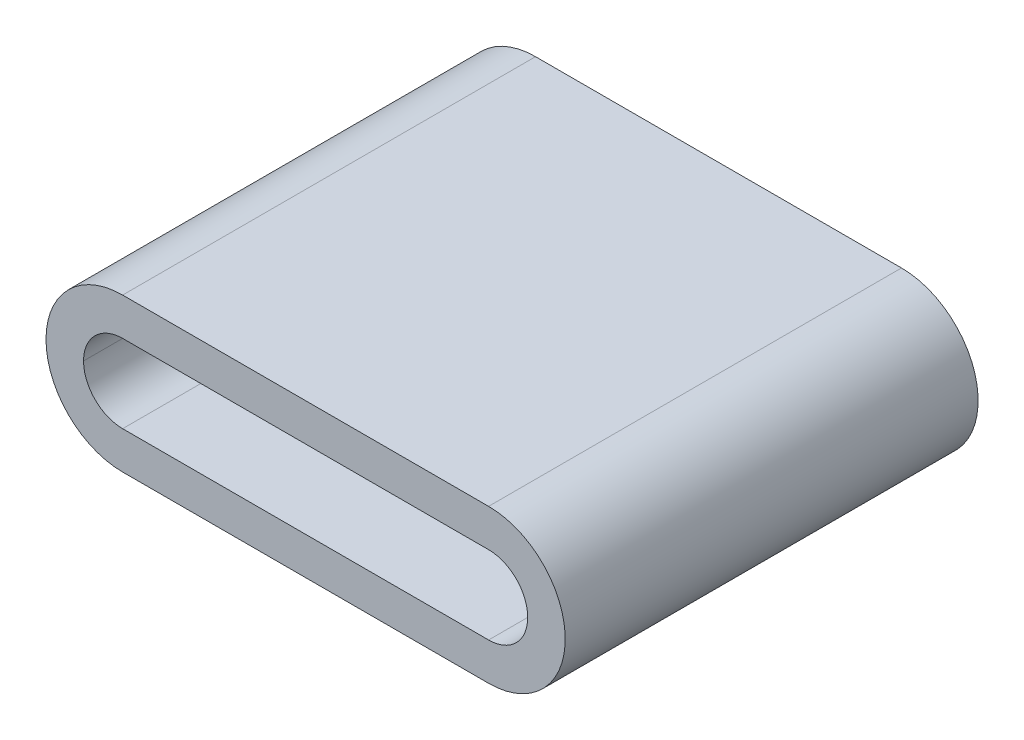
ISO-10303-21;
HEADER;
FILE_DESCRIPTION(('STEP AP214'),'2;1');
FILE_NAME('part.step','',(''),(''),'','','');
FILE_SCHEMA(('AUTOMOTIVE_DESIGN { 1 0 10303 214 1 1 1 1 }'));
ENDSEC;
DATA;
#1=APPLICATION_CONTEXT('core data for automotive mechanical design processes');
#2=APPLICATION_PROTOCOL_DEFINITION('international standard','automotive_design',2000,#1);
#3=PRODUCT_CONTEXT('',#1,'mechanical');
#4=PRODUCT('Part','Part','',(#3));
#5=PRODUCT_RELATED_PRODUCT_CATEGORY('part','',(#4));
#6=PRODUCT_DEFINITION_FORMATION('','',#4);
#7=PRODUCT_DEFINITION_CONTEXT('part definition',#1,'design');
#8=PRODUCT_DEFINITION('design','',#6,#7);
#9=PRODUCT_DEFINITION_SHAPE('','',#8);
#10=(LENGTH_UNIT() NAMED_UNIT(*) SI_UNIT(.MILLI.,.METRE.));
#11=(NAMED_UNIT(*) PLANE_ANGLE_UNIT() SI_UNIT($,.RADIAN.));
#12=(NAMED_UNIT(*) SI_UNIT($,.STERADIAN.) SOLID_ANGLE_UNIT());
#13=UNCERTAINTY_MEASURE_WITH_UNIT(LENGTH_MEASURE(1.E-05),#10,'distance_accuracy_value','');
#14=(GEOMETRIC_REPRESENTATION_CONTEXT(3) GLOBAL_UNCERTAINTY_ASSIGNED_CONTEXT((#13)) GLOBAL_UNIT_ASSIGNED_CONTEXT((#10,
#11,#12)) REPRESENTATION_CONTEXT('',''));
#15=CARTESIAN_POINT('',(0.,0.,0.));
#16=DIRECTION('',(0.,0.,1.));
#17=DIRECTION('',(1.,0.,0.));
#18=AXIS2_PLACEMENT_3D('',#15,#16,#17);
#19=CARTESIAN_POINT('',(2.925,0.,6.6));
#20=DIRECTION('',(0.,0.,-1.));
#21=DIRECTION('',(-1.,0.,0.));
#22=AXIS2_PLACEMENT_3D('',#19,#20,#21);
#23=CYLINDRICAL_SURFACE('',#22,0.625);
#24=DIRECTION('',(0.,0.,1.));
#25=VECTOR('',#24,1.);
#26=CARTESIAN_POINT('',(2.925,-0.625,0.));
#27=LINE('',#26,#25);
#28=CARTESIAN_POINT('',(2.925,-0.625,0.));
#29=VERTEX_POINT('',#28);
#30=CARTESIAN_POINT('',(2.925,-0.625,6.6));
#31=VERTEX_POINT('',#30);
#32=EDGE_CURVE('E11',#29,#31,#27,.T.);
#33=ORIENTED_EDGE('',*,*,#32,.T.);
#34=CARTESIAN_POINT('',(2.925,0.,6.6));
#35=DIRECTION('',(0.,0.,-1.));
#36=DIRECTION('',(0.,1.,0.));
#37=AXIS2_PLACEMENT_3D('',#34,#35,#36);
#38=CIRCLE('',#37,0.625);
#39=CARTESIAN_POINT('',(2.925,0.625,6.6));
#40=VERTEX_POINT('',#39);
#41=EDGE_CURVE('E156',#40,#31,#38,.T.);
#42=ORIENTED_EDGE('',*,*,#41,.F.);
#43=DIRECTION('',(0.,0.,-1.));
#44=VECTOR('',#43,1.);
#45=CARTESIAN_POINT('',(2.925,0.625,6.6));
#46=LINE('',#45,#44);
#47=CARTESIAN_POINT('',(2.925,0.625,0.));
#48=VERTEX_POINT('',#47);
#49=EDGE_CURVE('E165',#40,#48,#46,.T.);
#50=ORIENTED_EDGE('',*,*,#49,.T.);
#51=CARTESIAN_POINT('',(2.925,0.,0.));
#52=DIRECTION('',(0.,0.,1.));
#53=DIRECTION('',(0.,-1.,0.));
#54=AXIS2_PLACEMENT_3D('',#51,#52,#53);
#55=CIRCLE('',#54,0.625);
#56=EDGE_CURVE('E147',#29,#48,#55,.T.);
#57=ORIENTED_EDGE('',*,*,#56,.F.);
#58=EDGE_LOOP('',(#33,#42,#50,#57));
#59=FACE_BOUND('',#58,.T.);
#60=ADVANCED_FACE('F16',(#59),#23,.F.);
#61=CARTESIAN_POINT('',(2.925,-0.625,6.6));
#62=DIRECTION('',(0.,1.,0.));
#63=DIRECTION('',(1.,0.,0.));
#64=AXIS2_PLACEMENT_3D('',#61,#62,#63);
#65=PLANE('',#64);
#66=DIRECTION('',(0.,0.,-1.));
#67=VECTOR('',#66,1.);
#68=CARTESIAN_POINT('',(-2.925,-0.625,6.6));
#69=LINE('',#68,#67);
#70=CARTESIAN_POINT('',(-2.925,-0.625,6.6));
#71=VERTEX_POINT('',#70);
#72=CARTESIAN_POINT('',(-2.925,-0.625,0.));
#73=VERTEX_POINT('',#72);
#74=EDGE_CURVE('E27',#71,#73,#69,.T.);
#75=ORIENTED_EDGE('',*,*,#74,.F.);
#76=DIRECTION('',(-1.,0.,0.));
#77=VECTOR('',#76,1.);
#78=CARTESIAN_POINT('',(2.925,-0.625,6.6));
#79=LINE('',#78,#77);
#80=EDGE_CURVE('E174',#31,#71,#79,.T.);
#81=ORIENTED_EDGE('',*,*,#80,.F.);
#82=ORIENTED_EDGE('',*,*,#32,.F.);
#83=DIRECTION('',(-1.,0.,0.));
#84=VECTOR('',#83,1.);
#85=CARTESIAN_POINT('',(2.925,-0.625,0.));
#86=LINE('',#85,#84);
#87=EDGE_CURVE('E190',#29,#73,#86,.T.);
#88=ORIENTED_EDGE('',*,*,#87,.T.);
#89=EDGE_LOOP('',(#75,#81,#82,#88));
#90=FACE_BOUND('',#89,.T.);
#91=ADVANCED_FACE('F18',(#90),#65,.T.);
#92=CARTESIAN_POINT('',(-2.925,0.,6.6));
#93=DIRECTION('',(0.,0.,-1.));
#94=DIRECTION('',(-1.,0.,0.));
#95=AXIS2_PLACEMENT_3D('',#92,#93,#94);
#96=CYLINDRICAL_SURFACE('',#95,0.625);
#97=CARTESIAN_POINT('',(-2.925,0.,6.6));
#98=DIRECTION('',(0.,0.,-1.));
#99=DIRECTION('',(0.,-1.,0.));
#100=AXIS2_PLACEMENT_3D('',#97,#98,#99);
#101=CIRCLE('',#100,0.625);
#102=CARTESIAN_POINT('',(-3.55,0.,6.6));
#103=VERTEX_POINT('',#102);
#104=EDGE_CURVE('E170',#71,#103,#101,.T.);
#105=ORIENTED_EDGE('',*,*,#104,.F.);
#106=ORIENTED_EDGE('',*,*,#74,.T.);
#107=CARTESIAN_POINT('',(-2.925,0.,0.));
#108=DIRECTION('',(0.,0.,1.));
#109=DIRECTION('',(-1.,0.,0.));
#110=AXIS2_PLACEMENT_3D('',#107,#108,#109);
#111=CIRCLE('',#110,0.625);
#112=CARTESIAN_POINT('',(-3.55,0.,0.));
#113=VERTEX_POINT('',#112);
#114=EDGE_CURVE('E142',#113,#73,#111,.T.);
#115=ORIENTED_EDGE('',*,*,#114,.F.);
#116=DIRECTION('',(0.,0.,1.));
#117=VECTOR('',#116,1.);
#118=CARTESIAN_POINT('',(-3.55,0.,0.));
#119=LINE('',#118,#117);
#120=EDGE_CURVE('E41',#113,#103,#119,.T.);
#121=ORIENTED_EDGE('',*,*,#120,.T.);
#122=EDGE_LOOP('',(#105,#106,#115,#121));
#123=FACE_BOUND('',#122,.T.);
#124=ADVANCED_FACE('F244',(#123),#96,.F.);
#125=CARTESIAN_POINT('',(-2.925,0.,6.6));
#126=DIRECTION('',(0.,0.,-1.));
#127=DIRECTION('',(-1.,0.,0.));
#128=AXIS2_PLACEMENT_3D('',#125,#126,#127);
#129=CYLINDRICAL_SURFACE('',#128,0.625);
#130=ORIENTED_EDGE('',*,*,#120,.F.);
#131=CARTESIAN_POINT('',(-2.925,0.,0.));
#132=DIRECTION('',(0.,0.,1.));
#133=DIRECTION('',(0.,1.,0.));
#134=AXIS2_PLACEMENT_3D('',#131,#132,#133);
#135=CIRCLE('',#134,0.625);
#136=CARTESIAN_POINT('',(-2.925,0.625,0.));
#137=VERTEX_POINT('',#136);
#138=EDGE_CURVE('E158',#137,#113,#135,.T.);
#139=ORIENTED_EDGE('',*,*,#138,.F.);
#140=DIRECTION('',(0.,0.,1.));
#141=VECTOR('',#140,1.);
#142=CARTESIAN_POINT('',(-2.925,0.625,0.));
#143=LINE('',#142,#141);
#144=CARTESIAN_POINT('',(-2.925,0.625,6.6));
#145=VERTEX_POINT('',#144);
#146=EDGE_CURVE('E148',#137,#145,#143,.T.);
#147=ORIENTED_EDGE('',*,*,#146,.T.);
#148=CARTESIAN_POINT('',(-2.925,0.,6.6));
#149=DIRECTION('',(0.,0.,-1.));
#150=DIRECTION('',(-1.,0.,0.));
#151=AXIS2_PLACEMENT_3D('',#148,#149,#150);
#152=CIRCLE('',#151,0.625);
#153=EDGE_CURVE('E117',#103,#145,#152,.T.);
#154=ORIENTED_EDGE('',*,*,#153,.F.);
#155=EDGE_LOOP('',(#130,#139,#147,#154));
#156=FACE_BOUND('',#155,.T.);
#157=ADVANCED_FACE('F238',(#156),#129,.F.);
#158=CARTESIAN_POINT('',(2.925,1.225,6.6));
#159=DIRECTION('',(0.,-1.,0.));
#160=DIRECTION('',(0.,0.,-1.));
#161=AXIS2_PLACEMENT_3D('',#158,#159,#160);
#162=PLANE('',#161);
#163=DIRECTION('',(0.,0.,-1.));
#164=VECTOR('',#163,1.);
#165=CARTESIAN_POINT('',(-2.925,1.225,6.6));
#166=LINE('',#165,#164);
#167=CARTESIAN_POINT('',(-2.925,1.225,6.6));
#168=VERTEX_POINT('',#167);
#169=CARTESIAN_POINT('',(-2.925,1.225,0.));
#170=VERTEX_POINT('',#169);
#171=EDGE_CURVE('E105',#168,#170,#166,.T.);
#172=ORIENTED_EDGE('',*,*,#171,.F.);
#173=DIRECTION('',(1.,0.,0.));
#174=VECTOR('',#173,1.);
#175=CARTESIAN_POINT('',(-2.925,1.225,6.6));
#176=LINE('',#175,#174);
#177=CARTESIAN_POINT('',(2.925,1.225,6.6));
#178=VERTEX_POINT('',#177);
#179=EDGE_CURVE('E157',#168,#178,#176,.T.);
#180=ORIENTED_EDGE('',*,*,#179,.T.);
#181=DIRECTION('',(0.,0.,1.));
#182=VECTOR('',#181,1.);
#183=CARTESIAN_POINT('',(2.925,1.225,0.));
#184=LINE('',#183,#182);
#185=CARTESIAN_POINT('',(2.925,1.225,0.));
#186=VERTEX_POINT('',#185);
#187=EDGE_CURVE('E123',#186,#178,#184,.T.);
#188=ORIENTED_EDGE('',*,*,#187,.F.);
#189=DIRECTION('',(1.,0.,0.));
#190=VECTOR('',#189,1.);
#191=CARTESIAN_POINT('',(-2.925,1.225,0.));
#192=LINE('',#191,#190);
#193=EDGE_CURVE('E120',#170,#186,#192,.T.);
#194=ORIENTED_EDGE('',*,*,#193,.F.);
#195=EDGE_LOOP('',(#172,#180,#188,#194));
#196=FACE_BOUND('',#195,.T.);
#197=ADVANCED_FACE('F121',(#196),#162,.F.);
#198=CARTESIAN_POINT('',(-2.925,0.,6.6));
#199=DIRECTION('',(0.,0.,-1.));
#200=DIRECTION('',(-1.,0.,0.));
#201=AXIS2_PLACEMENT_3D('',#198,#199,#200);
#202=CYLINDRICAL_SURFACE('',#201,1.225);
#203=CARTESIAN_POINT('',(-2.925,0.,6.6));
#204=DIRECTION('',(0.,0.,1.));
#205=DIRECTION('',(0.,1.,0.));
#206=AXIS2_PLACEMENT_3D('',#203,#204,#205);
#207=CIRCLE('',#206,1.225);
#208=CARTESIAN_POINT('',(-4.15,0.,6.6));
#209=VERTEX_POINT('',#208);
#210=EDGE_CURVE('E113',#168,#209,#207,.T.);
#211=ORIENTED_EDGE('',*,*,#210,.F.);
#212=ORIENTED_EDGE('',*,*,#171,.T.);
#213=CARTESIAN_POINT('',(-2.925,0.,0.));
#214=DIRECTION('',(0.,0.,-1.));
#215=DIRECTION('',(-1.,0.,0.));
#216=AXIS2_PLACEMENT_3D('',#213,#214,#215);
#217=CIRCLE('',#216,1.225);
#218=CARTESIAN_POINT('',(-4.15,0.,0.));
#219=VERTEX_POINT('',#218);
#220=EDGE_CURVE('E110',#219,#170,#217,.T.);
#221=ORIENTED_EDGE('',*,*,#220,.F.);
#222=DIRECTION('',(0.,0.,1.));
#223=VECTOR('',#222,1.);
#224=CARTESIAN_POINT('',(-4.15,0.,0.));
#225=LINE('',#224,#223);
#226=EDGE_CURVE('E187',#219,#209,#225,.T.);
#227=ORIENTED_EDGE('',*,*,#226,.T.);
#228=EDGE_LOOP('',(#211,#212,#221,#227));
#229=FACE_BOUND('',#228,.T.);
#230=ADVANCED_FACE('F107',(#229),#202,.T.);
#231=CARTESIAN_POINT('',(2.925,0.,6.6));
#232=DIRECTION('',(0.,0.,1.));
#233=DIRECTION('',(1.,0.,0.));
#234=AXIS2_PLACEMENT_3D('',#231,#232,#233);
#235=PLANE('',#234);
#236=ORIENTED_EDGE('',*,*,#41,.T.);
#237=ORIENTED_EDGE('',*,*,#80,.T.);
#238=ORIENTED_EDGE('',*,*,#104,.T.);
#239=ORIENTED_EDGE('',*,*,#153,.T.);
#240=DIRECTION('',(1.,0.,0.));
#241=VECTOR('',#240,1.);
#242=CARTESIAN_POINT('',(-2.925,0.625,6.6));
#243=LINE('',#242,#241);
#244=EDGE_CURVE('E153',#145,#40,#243,.T.);
#245=ORIENTED_EDGE('',*,*,#244,.T.);
#246=EDGE_LOOP('',(#236,#237,#238,#239,#245));
#247=FACE_BOUND('',#246,.T.);
#248=ORIENTED_EDGE('',*,*,#179,.F.);
#249=ORIENTED_EDGE('',*,*,#210,.T.);
#250=CARTESIAN_POINT('',(-2.925,0.,6.6));
#251=DIRECTION('',(0.,0.,1.));
#252=DIRECTION('',(-1.,0.,0.));
#253=AXIS2_PLACEMENT_3D('',#250,#251,#252);
#254=CIRCLE('',#253,1.225);
#255=CARTESIAN_POINT('',(-2.925,-1.225,6.6));
#256=VERTEX_POINT('',#255);
#257=EDGE_CURVE('E184',#209,#256,#254,.T.);
#258=ORIENTED_EDGE('',*,*,#257,.T.);
#259=DIRECTION('',(-1.,0.,0.));
#260=VECTOR('',#259,1.);
#261=CARTESIAN_POINT('',(2.925,-1.225,6.6));
#262=LINE('',#261,#260);
#263=CARTESIAN_POINT('',(2.925,-1.225,6.6));
#264=VERTEX_POINT('',#263);
#265=EDGE_CURVE('E20',#264,#256,#262,.T.);
#266=ORIENTED_EDGE('',*,*,#265,.F.);
#267=CARTESIAN_POINT('',(2.925,0.,6.6));
#268=DIRECTION('',(0.,0.,1.));
#269=DIRECTION('',(0.,-1.,0.));
#270=AXIS2_PLACEMENT_3D('',#267,#268,#269);
#271=CIRCLE('',#270,1.225);
#272=EDGE_CURVE('E146',#264,#178,#271,.T.);
#273=ORIENTED_EDGE('',*,*,#272,.T.);
#274=EDGE_LOOP('',(#248,#249,#258,#266,#273));
#275=FACE_BOUND('',#274,.T.);
#276=ADVANCED_FACE('F234',(#247,#275),#235,.T.);
#277=CARTESIAN_POINT('',(-2.925,0.,6.6));
#278=DIRECTION('',(0.,0.,-1.));
#279=DIRECTION('',(-1.,0.,0.));
#280=AXIS2_PLACEMENT_3D('',#277,#278,#279);
#281=CYLINDRICAL_SURFACE('',#280,1.225);
#282=ORIENTED_EDGE('',*,*,#226,.F.);
#283=CARTESIAN_POINT('',(-2.925,0.,0.));
#284=DIRECTION('',(0.,0.,-1.));
#285=DIRECTION('',(0.,-1.,0.));
#286=AXIS2_PLACEMENT_3D('',#283,#284,#285);
#287=CIRCLE('',#286,1.225);
#288=CARTESIAN_POINT('',(-2.925,-1.225,0.));
#289=VERTEX_POINT('',#288);
#290=EDGE_CURVE('E133',#289,#219,#287,.T.);
#291=ORIENTED_EDGE('',*,*,#290,.F.);
#292=DIRECTION('',(0.,0.,1.));
#293=VECTOR('',#292,1.);
#294=CARTESIAN_POINT('',(-2.925,-1.225,0.));
#295=LINE('',#294,#293);
#296=EDGE_CURVE('E201',#289,#256,#295,.T.);
#297=ORIENTED_EDGE('',*,*,#296,.T.);
#298=ORIENTED_EDGE('',*,*,#257,.F.);
#299=EDGE_LOOP('',(#282,#291,#297,#298));
#300=FACE_BOUND('',#299,.T.);
#301=ADVANCED_FACE('F260',(#300),#281,.T.);
#302=CARTESIAN_POINT('',(2.925,-1.225,6.6));
#303=DIRECTION('',(0.,1.,0.));
#304=DIRECTION('',(1.,0.,0.));
#305=AXIS2_PLACEMENT_3D('',#302,#303,#304);
#306=PLANE('',#305);
#307=DIRECTION('',(0.,0.,-1.));
#308=VECTOR('',#307,1.);
#309=CARTESIAN_POINT('',(2.925,-1.225,6.6));
#310=LINE('',#309,#308);
#311=CARTESIAN_POINT('',(2.925,-1.225,0.));
#312=VERTEX_POINT('',#311);
#313=EDGE_CURVE('E169',#264,#312,#310,.T.);
#314=ORIENTED_EDGE('',*,*,#313,.F.);
#315=ORIENTED_EDGE('',*,*,#265,.T.);
#316=ORIENTED_EDGE('',*,*,#296,.F.);
#317=DIRECTION('',(-1.,0.,0.));
#318=VECTOR('',#317,1.);
#319=CARTESIAN_POINT('',(2.925,-1.225,0.));
#320=LINE('',#319,#318);
#321=EDGE_CURVE('E139',#312,#289,#320,.T.);
#322=ORIENTED_EDGE('',*,*,#321,.F.);
#323=EDGE_LOOP('',(#314,#315,#316,#322));
#324=FACE_BOUND('',#323,.T.);
#325=ADVANCED_FACE('F261',(#324),#306,.F.);
#326=CARTESIAN_POINT('',(2.925,0.,6.6));
#327=DIRECTION('',(0.,0.,-1.));
#328=DIRECTION('',(-1.,0.,0.));
#329=AXIS2_PLACEMENT_3D('',#326,#327,#328);
#330=CYLINDRICAL_SURFACE('',#329,1.225);
#331=ORIENTED_EDGE('',*,*,#187,.T.);
#332=ORIENTED_EDGE('',*,*,#272,.F.);
#333=ORIENTED_EDGE('',*,*,#313,.T.);
#334=CARTESIAN_POINT('',(2.925,0.,0.));
#335=DIRECTION('',(0.,0.,-1.));
#336=DIRECTION('',(0.,1.,0.));
#337=AXIS2_PLACEMENT_3D('',#334,#335,#336);
#338=CIRCLE('',#337,1.225);
#339=EDGE_CURVE('E128',#186,#312,#338,.T.);
#340=ORIENTED_EDGE('',*,*,#339,.F.);
#341=EDGE_LOOP('',(#331,#332,#333,#340));
#342=FACE_BOUND('',#341,.T.);
#343=ADVANCED_FACE('F264',(#342),#330,.T.);
#344=CARTESIAN_POINT('',(2.925,0.,0.));
#345=DIRECTION('',(0.,0.,1.));
#346=DIRECTION('',(1.,0.,0.));
#347=AXIS2_PLACEMENT_3D('',#344,#345,#346);
#348=PLANE('',#347);
#349=DIRECTION('',(1.,0.,0.));
#350=VECTOR('',#349,1.);
#351=CARTESIAN_POINT('',(-2.925,0.625,0.));
#352=LINE('',#351,#350);
#353=EDGE_CURVE('E152',#137,#48,#352,.T.);
#354=ORIENTED_EDGE('',*,*,#353,.F.);
#355=ORIENTED_EDGE('',*,*,#138,.T.);
#356=ORIENTED_EDGE('',*,*,#114,.T.);
#357=ORIENTED_EDGE('',*,*,#87,.F.);
#358=ORIENTED_EDGE('',*,*,#56,.T.);
#359=EDGE_LOOP('',(#354,#355,#356,#357,#358));
#360=FACE_BOUND('',#359,.T.);
#361=ORIENTED_EDGE('',*,*,#321,.T.);
#362=ORIENTED_EDGE('',*,*,#290,.T.);
#363=ORIENTED_EDGE('',*,*,#220,.T.);
#364=ORIENTED_EDGE('',*,*,#193,.T.);
#365=ORIENTED_EDGE('',*,*,#339,.T.);
#366=EDGE_LOOP('',(#361,#362,#363,#364,#365));
#367=FACE_BOUND('',#366,.T.);
#368=ADVANCED_FACE('F131',(#360,#367),#348,.F.);
#369=CARTESIAN_POINT('',(2.925,0.625,6.6));
#370=DIRECTION('',(0.,-1.,0.));
#371=DIRECTION('',(0.,0.,-1.));
#372=AXIS2_PLACEMENT_3D('',#369,#370,#371);
#373=PLANE('',#372);
#374=ORIENTED_EDGE('',*,*,#49,.F.);
#375=ORIENTED_EDGE('',*,*,#244,.F.);
#376=ORIENTED_EDGE('',*,*,#146,.F.);
#377=ORIENTED_EDGE('',*,*,#353,.T.);
#378=EDGE_LOOP('',(#374,#375,#376,#377));
#379=FACE_BOUND('',#378,.T.);
#380=ADVANCED_FACE('F227',(#379),#373,.T.);
#381=CLOSED_SHELL('',(#60,#91,#124,#157,#197,#230,#276,#301,#325,#343,#368,#380));
#382=MANIFOLD_SOLID_BREP('B1',#381);
#383=ADVANCED_BREP_SHAPE_REPRESENTATION('',(#18,#382),#14);
#384=SHAPE_DEFINITION_REPRESENTATION(#9,#383);
ENDSEC;
END-ISO-10303-21;
